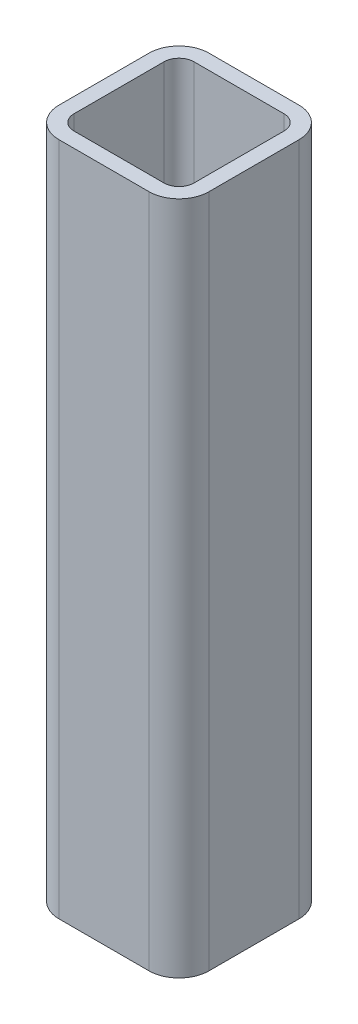
ISO-10303-21;
HEADER;
FILE_DESCRIPTION(('STEP AP214'),'2;1');
FILE_NAME('part.step','',(''),(''),'','','');
FILE_SCHEMA(('AUTOMOTIVE_DESIGN { 1 0 10303 214 1 1 1 1 }'));
ENDSEC;
DATA;
#1=APPLICATION_CONTEXT('core data for automotive mechanical design processes');
#2=APPLICATION_PROTOCOL_DEFINITION('international standard','automotive_design',2000,#1);
#3=PRODUCT_CONTEXT('',#1,'mechanical');
#4=PRODUCT('Part','Part','',(#3));
#5=PRODUCT_RELATED_PRODUCT_CATEGORY('part','',(#4));
#6=PRODUCT_DEFINITION_FORMATION('','',#4);
#7=PRODUCT_DEFINITION_CONTEXT('part definition',#1,'design');
#8=PRODUCT_DEFINITION('design','',#6,#7);
#9=PRODUCT_DEFINITION_SHAPE('','',#8);
#10=(LENGTH_UNIT() NAMED_UNIT(*) SI_UNIT(.MILLI.,.METRE.));
#11=(NAMED_UNIT(*) PLANE_ANGLE_UNIT() SI_UNIT($,.RADIAN.));
#12=(NAMED_UNIT(*) SI_UNIT($,.STERADIAN.) SOLID_ANGLE_UNIT());
#13=UNCERTAINTY_MEASURE_WITH_UNIT(LENGTH_MEASURE(1.E-05),#10,'distance_accuracy_value','');
#14=(GEOMETRIC_REPRESENTATION_CONTEXT(3) GLOBAL_UNCERTAINTY_ASSIGNED_CONTEXT((#13)) GLOBAL_UNIT_ASSIGNED_CONTEXT((#10,
#11,#12)) REPRESENTATION_CONTEXT('',''));
#15=CARTESIAN_POINT('',(0.,0.,0.));
#16=DIRECTION('',(0.,0.,1.));
#17=DIRECTION('',(1.,0.,0.));
#18=AXIS2_PLACEMENT_3D('',#15,#16,#17);
#19=CARTESIAN_POINT('',(6.00000000000001,90.0000000000001,-6.00000000000001));
#20=DIRECTION('',(0.,-1.,0.));
#21=DIRECTION('',(0.,0.,-1.));
#22=AXIS2_PLACEMENT_3D('',#19,#20,#21);
#23=CYLINDRICAL_SURFACE('',#22,4.);
#24=CARTESIAN_POINT('',(6.00000000000001,0.,-6.00000000000001));
#25=DIRECTION('',(0.,1.,0.));
#26=DIRECTION('',(0.,0.,1.));
#27=AXIS2_PLACEMENT_3D('',#24,#25,#26);
#28=CIRCLE('',#27,4.);
#29=CARTESIAN_POINT('',(10.,0.,-6.00000000000001));
#30=VERTEX_POINT('',#29);
#31=CARTESIAN_POINT('',(6.00000000000001,0.,-10.));
#32=VERTEX_POINT('',#31);
#33=EDGE_CURVE('E239',#30,#32,#28,.T.);
#34=ORIENTED_EDGE('',*,*,#33,.T.);
#35=DIRECTION('',(0.,-1.,0.));
#36=VECTOR('',#35,1.);
#37=CARTESIAN_POINT('',(6.00000000000001,90.0000000000001,-10.));
#38=LINE('',#37,#36);
#39=CARTESIAN_POINT('',(6.00000000000001,90.0000000000001,-10.));
#40=VERTEX_POINT('',#39);
#41=EDGE_CURVE('E12',#40,#32,#38,.T.);
#42=ORIENTED_EDGE('',*,*,#41,.F.);
#43=CARTESIAN_POINT('',(6.00000000000001,90.0000000000001,-6.00000000000001));
#44=DIRECTION('',(0.,1.,0.));
#45=DIRECTION('',(0.,0.,1.));
#46=AXIS2_PLACEMENT_3D('',#43,#44,#45);
#47=CIRCLE('',#46,4.);
#48=CARTESIAN_POINT('',(10.,90.0000000000001,-6.00000000000001));
#49=VERTEX_POINT('',#48);
#50=EDGE_CURVE('E317',#49,#40,#47,.T.);
#51=ORIENTED_EDGE('',*,*,#50,.F.);
#52=DIRECTION('',(0.,-1.,0.));
#53=VECTOR('',#52,1.);
#54=CARTESIAN_POINT('',(10.,90.0000000000001,-6.00000000000001));
#55=LINE('',#54,#53);
#56=EDGE_CURVE('E254',#49,#30,#55,.T.);
#57=ORIENTED_EDGE('',*,*,#56,.T.);
#58=EDGE_LOOP('',(#34,#42,#51,#57));
#59=FACE_BOUND('',#58,.T.);
#60=ADVANCED_FACE('F67',(#59),#23,.T.);
#61=CARTESIAN_POINT('',(6.00000000000001,90.0000000000001,-10.));
#62=DIRECTION('',(0.,0.,1.));
#63=DIRECTION('',(1.,0.,0.));
#64=AXIS2_PLACEMENT_3D('',#61,#62,#63);
#65=PLANE('',#64);
#66=DIRECTION('',(-1.,0.,0.));
#67=VECTOR('',#66,1.);
#68=CARTESIAN_POINT('',(6.00000000000001,0.,-10.));
#69=LINE('',#68,#67);
#70=CARTESIAN_POINT('',(-6.00000000000001,0.,-10.));
#71=VERTEX_POINT('',#70);
#72=EDGE_CURVE('E242',#32,#71,#69,.T.);
#73=ORIENTED_EDGE('',*,*,#72,.T.);
#74=DIRECTION('',(0.,-1.,0.));
#75=VECTOR('',#74,1.);
#76=CARTESIAN_POINT('',(-6.00000000000001,90.0000000000001,-10.));
#77=LINE('',#76,#75);
#78=CARTESIAN_POINT('',(-6.00000000000001,90.0000000000001,-10.));
#79=VERTEX_POINT('',#78);
#80=EDGE_CURVE('E77',#79,#71,#77,.T.);
#81=ORIENTED_EDGE('',*,*,#80,.F.);
#82=DIRECTION('',(-1.,0.,0.));
#83=VECTOR('',#82,1.);
#84=CARTESIAN_POINT('',(6.00000000000001,90.0000000000001,-10.));
#85=LINE('',#84,#83);
#86=EDGE_CURVE('E319',#40,#79,#85,.T.);
#87=ORIENTED_EDGE('',*,*,#86,.F.);
#88=ORIENTED_EDGE('',*,*,#41,.T.);
#89=EDGE_LOOP('',(#73,#81,#87,#88));
#90=FACE_BOUND('',#89,.T.);
#91=ADVANCED_FACE('F355',(#90),#65,.F.);
#92=CARTESIAN_POINT('',(-6.00000000000001,90.0000000000001,-6.00000000000001));
#93=DIRECTION('',(0.,-1.,0.));
#94=DIRECTION('',(0.,0.,-1.));
#95=AXIS2_PLACEMENT_3D('',#92,#93,#94);
#96=CYLINDRICAL_SURFACE('',#95,4.);
#97=CARTESIAN_POINT('',(-6.00000000000001,0.,-6.00000000000001));
#98=DIRECTION('',(0.,1.,0.));
#99=DIRECTION('',(0.,0.,1.));
#100=AXIS2_PLACEMENT_3D('',#97,#98,#99);
#101=CIRCLE('',#100,4.);
#102=CARTESIAN_POINT('',(-10.,0.,-6.00000000000001));
#103=VERTEX_POINT('',#102);
#104=EDGE_CURVE('E244',#71,#103,#101,.T.);
#105=ORIENTED_EDGE('',*,*,#104,.T.);
#106=DIRECTION('',(0.,-1.,0.));
#107=VECTOR('',#106,1.);
#108=CARTESIAN_POINT('',(-10.,90.0000000000001,-6.00000000000001));
#109=LINE('',#108,#107);
#110=CARTESIAN_POINT('',(-10.,90.0000000000001,-6.00000000000001));
#111=VERTEX_POINT('',#110);
#112=EDGE_CURVE('E261',#111,#103,#109,.T.);
#113=ORIENTED_EDGE('',*,*,#112,.F.);
#114=CARTESIAN_POINT('',(-6.00000000000001,90.0000000000001,-6.00000000000001));
#115=DIRECTION('',(0.,1.,0.));
#116=DIRECTION('',(0.,0.,1.));
#117=AXIS2_PLACEMENT_3D('',#114,#115,#116);
#118=CIRCLE('',#117,4.);
#119=EDGE_CURVE('E321',#79,#111,#118,.T.);
#120=ORIENTED_EDGE('',*,*,#119,.F.);
#121=ORIENTED_EDGE('',*,*,#80,.T.);
#122=EDGE_LOOP('',(#105,#113,#120,#121));
#123=FACE_BOUND('',#122,.T.);
#124=ADVANCED_FACE('F361',(#123),#96,.T.);
#125=CARTESIAN_POINT('',(-10.,90.0000000000001,6.00000000000001));
#126=DIRECTION('',(1.,0.,0.));
#127=DIRECTION('',(0.,0.,-1.));
#128=AXIS2_PLACEMENT_3D('',#125,#126,#127);
#129=PLANE('',#128);
#130=DIRECTION('',(0.,0.,1.));
#131=VECTOR('',#130,1.);
#132=CARTESIAN_POINT('',(-10.,0.,6.00000000000001));
#133=LINE('',#132,#131);
#134=CARTESIAN_POINT('',(-10.,0.,6.00000000000001));
#135=VERTEX_POINT('',#134);
#136=EDGE_CURVE('E246',#103,#135,#133,.T.);
#137=ORIENTED_EDGE('',*,*,#136,.T.);
#138=DIRECTION('',(0.,-1.,0.));
#139=VECTOR('',#138,1.);
#140=CARTESIAN_POINT('',(-10.,90.0000000000001,6.00000000000001));
#141=LINE('',#140,#139);
#142=CARTESIAN_POINT('',(-10.,90.0000000000001,6.00000000000001));
#143=VERTEX_POINT('',#142);
#144=EDGE_CURVE('E258',#143,#135,#141,.T.);
#145=ORIENTED_EDGE('',*,*,#144,.F.);
#146=DIRECTION('',(0.,0.,1.));
#147=VECTOR('',#146,1.);
#148=CARTESIAN_POINT('',(-10.,90.0000000000001,6.00000000000001));
#149=LINE('',#148,#147);
#150=EDGE_CURVE('E323',#111,#143,#149,.T.);
#151=ORIENTED_EDGE('',*,*,#150,.F.);
#152=ORIENTED_EDGE('',*,*,#112,.T.);
#153=EDGE_LOOP('',(#137,#145,#151,#152));
#154=FACE_BOUND('',#153,.T.);
#155=ADVANCED_FACE('F329',(#154),#129,.F.);
#156=CARTESIAN_POINT('',(-6.00000000000001,90.0000000000001,6.00000000000001));
#157=DIRECTION('',(0.,-1.,0.));
#158=DIRECTION('',(0.,0.,-1.));
#159=AXIS2_PLACEMENT_3D('',#156,#157,#158);
#160=CYLINDRICAL_SURFACE('',#159,4.);
#161=CARTESIAN_POINT('',(-6.00000000000001,0.,6.00000000000001));
#162=DIRECTION('',(0.,1.,0.));
#163=DIRECTION('',(0.,0.,1.));
#164=AXIS2_PLACEMENT_3D('',#161,#162,#163);
#165=CIRCLE('',#164,4.);
#166=CARTESIAN_POINT('',(-6.00000000000001,0.,10.));
#167=VERTEX_POINT('',#166);
#168=EDGE_CURVE('E248',#135,#167,#165,.T.);
#169=ORIENTED_EDGE('',*,*,#168,.T.);
#170=DIRECTION('',(0.,-1.,0.));
#171=VECTOR('',#170,1.);
#172=CARTESIAN_POINT('',(-6.00000000000001,90.0000000000001,10.));
#173=LINE('',#172,#171);
#174=CARTESIAN_POINT('',(-6.00000000000001,90.0000000000001,10.));
#175=VERTEX_POINT('',#174);
#176=EDGE_CURVE('E206',#175,#167,#173,.T.);
#177=ORIENTED_EDGE('',*,*,#176,.F.);
#178=CARTESIAN_POINT('',(-6.00000000000001,90.0000000000001,6.00000000000001));
#179=DIRECTION('',(0.,1.,0.));
#180=DIRECTION('',(0.,0.,1.));
#181=AXIS2_PLACEMENT_3D('',#178,#179,#180);
#182=CIRCLE('',#181,4.);
#183=EDGE_CURVE('E197',#143,#175,#182,.T.);
#184=ORIENTED_EDGE('',*,*,#183,.F.);
#185=ORIENTED_EDGE('',*,*,#144,.T.);
#186=EDGE_LOOP('',(#169,#177,#184,#185));
#187=FACE_BOUND('',#186,.T.);
#188=ADVANCED_FACE('F333',(#187),#160,.T.);
#189=CARTESIAN_POINT('',(-6.00000000000001,90.0000000000001,10.));
#190=DIRECTION('',(0.,0.,-1.));
#191=DIRECTION('',(-1.,0.,0.));
#192=AXIS2_PLACEMENT_3D('',#189,#190,#191);
#193=PLANE('',#192);
#194=DIRECTION('',(1.,0.,0.));
#195=VECTOR('',#194,1.);
#196=CARTESIAN_POINT('',(-6.00000000000001,0.,10.));
#197=LINE('',#196,#195);
#198=CARTESIAN_POINT('',(6.00000000000001,0.,10.));
#199=VERTEX_POINT('',#198);
#200=EDGE_CURVE('E205',#167,#199,#197,.T.);
#201=ORIENTED_EDGE('',*,*,#200,.T.);
#202=DIRECTION('',(0.,-1.,0.));
#203=VECTOR('',#202,1.);
#204=CARTESIAN_POINT('',(6.00000000000001,90.0000000000001,10.));
#205=LINE('',#204,#203);
#206=CARTESIAN_POINT('',(6.00000000000001,90.0000000000001,10.));
#207=VERTEX_POINT('',#206);
#208=EDGE_CURVE('E202',#207,#199,#205,.T.);
#209=ORIENTED_EDGE('',*,*,#208,.F.);
#210=DIRECTION('',(1.,0.,0.));
#211=VECTOR('',#210,1.);
#212=CARTESIAN_POINT('',(-6.00000000000001,90.0000000000001,10.));
#213=LINE('',#212,#211);
#214=EDGE_CURVE('E191',#175,#207,#213,.T.);
#215=ORIENTED_EDGE('',*,*,#214,.F.);
#216=ORIENTED_EDGE('',*,*,#176,.T.);
#217=EDGE_LOOP('',(#201,#209,#215,#216));
#218=FACE_BOUND('',#217,.T.);
#219=ADVANCED_FACE('F203',(#218),#193,.F.);
#220=CARTESIAN_POINT('',(6.00000000000001,90.0000000000001,6.00000000000001));
#221=DIRECTION('',(0.,-1.,0.));
#222=DIRECTION('',(0.,0.,-1.));
#223=AXIS2_PLACEMENT_3D('',#220,#221,#222);
#224=CYLINDRICAL_SURFACE('',#223,4.);
#225=CARTESIAN_POINT('',(6.00000000000001,0.,6.00000000000001));
#226=DIRECTION('',(0.,1.,0.));
#227=DIRECTION('',(0.,0.,1.));
#228=AXIS2_PLACEMENT_3D('',#225,#226,#227);
#229=CIRCLE('',#228,4.);
#230=CARTESIAN_POINT('',(10.,0.,6.00000000000001));
#231=VERTEX_POINT('',#230);
#232=EDGE_CURVE('E139',#199,#231,#229,.T.);
#233=ORIENTED_EDGE('',*,*,#232,.T.);
#234=DIRECTION('',(0.,-1.,0.));
#235=VECTOR('',#234,1.);
#236=CARTESIAN_POINT('',(10.,90.0000000000001,6.00000000000001));
#237=LINE('',#236,#235);
#238=CARTESIAN_POINT('',(10.,90.0000000000001,6.00000000000001));
#239=VERTEX_POINT('',#238);
#240=EDGE_CURVE('E207',#239,#231,#237,.T.);
#241=ORIENTED_EDGE('',*,*,#240,.F.);
#242=CARTESIAN_POINT('',(6.00000000000001,90.0000000000001,6.00000000000001));
#243=DIRECTION('',(0.,1.,0.));
#244=DIRECTION('',(0.,0.,1.));
#245=AXIS2_PLACEMENT_3D('',#242,#243,#244);
#246=CIRCLE('',#245,4.);
#247=EDGE_CURVE('E195',#207,#239,#246,.T.);
#248=ORIENTED_EDGE('',*,*,#247,.F.);
#249=ORIENTED_EDGE('',*,*,#208,.T.);
#250=EDGE_LOOP('',(#233,#241,#248,#249));
#251=FACE_BOUND('',#250,.T.);
#252=ADVANCED_FACE('F209',(#251),#224,.T.);
#253=CARTESIAN_POINT('',(-6.00000000000001,90.0000000000001,-6.00000000000001));
#254=DIRECTION('',(0.,-1.,0.));
#255=DIRECTION('',(0.,0.,-1.));
#256=AXIS2_PLACEMENT_3D('',#253,#254,#255);
#257=CYLINDRICAL_SURFACE('',#256,2.);
#258=CARTESIAN_POINT('',(-6.00000000000001,0.,-6.00000000000001));
#259=DIRECTION('',(0.,1.,0.));
#260=DIRECTION('',(0.,0.,1.));
#261=AXIS2_PLACEMENT_3D('',#258,#259,#260);
#262=CIRCLE('',#261,2.);
#263=CARTESIAN_POINT('',(-6.00000000000001,0.,-8.00000000000001));
#264=VERTEX_POINT('',#263);
#265=CARTESIAN_POINT('',(-8.00000000000001,0.,-6.00000000000001));
#266=VERTEX_POINT('',#265);
#267=EDGE_CURVE('E215',#264,#266,#262,.T.);
#268=ORIENTED_EDGE('',*,*,#267,.F.);
#269=DIRECTION('',(0.,-1.,0.));
#270=VECTOR('',#269,1.);
#271=CARTESIAN_POINT('',(-6.00000000000001,90.0000000000001,-8.00000000000001));
#272=LINE('',#271,#270);
#273=CARTESIAN_POINT('',(-6.00000000000001,90.0000000000001,-8.00000000000001));
#274=VERTEX_POINT('',#273);
#275=EDGE_CURVE('E71',#274,#264,#272,.T.);
#276=ORIENTED_EDGE('',*,*,#275,.F.);
#277=CARTESIAN_POINT('',(-6.00000000000001,90.0000000000001,-6.00000000000001));
#278=DIRECTION('',(0.,1.,0.));
#279=DIRECTION('',(0.,0.,1.));
#280=AXIS2_PLACEMENT_3D('',#277,#278,#279);
#281=CIRCLE('',#280,2.);
#282=CARTESIAN_POINT('',(-8.00000000000001,90.0000000000001,-6.00000000000001));
#283=VERTEX_POINT('',#282);
#284=EDGE_CURVE('E253',#274,#283,#281,.T.);
#285=ORIENTED_EDGE('',*,*,#284,.T.);
#286=DIRECTION('',(0.,-1.,0.));
#287=VECTOR('',#286,1.);
#288=CARTESIAN_POINT('',(-8.00000000000001,90.0000000000001,-6.00000000000001));
#289=LINE('',#288,#287);
#290=EDGE_CURVE('E211',#283,#266,#289,.T.);
#291=ORIENTED_EDGE('',*,*,#290,.T.);
#292=EDGE_LOOP('',(#268,#276,#285,#291));
#293=FACE_BOUND('',#292,.T.);
#294=ADVANCED_FACE('F69',(#293),#257,.F.);
#295=CARTESIAN_POINT('',(6.00000000000001,90.0000000000001,-8.00000000000001));
#296=DIRECTION('',(0.,0.,1.));
#297=DIRECTION('',(1.,0.,0.));
#298=AXIS2_PLACEMENT_3D('',#295,#296,#297);
#299=PLANE('',#298);
#300=DIRECTION('',(-1.,0.,0.));
#301=VECTOR('',#300,1.);
#302=CARTESIAN_POINT('',(6.00000000000001,0.,-8.00000000000001));
#303=LINE('',#302,#301);
#304=CARTESIAN_POINT('',(6.00000000000001,0.,-8.00000000000001));
#305=VERTEX_POINT('',#304);
#306=EDGE_CURVE('E218',#305,#264,#303,.T.);
#307=ORIENTED_EDGE('',*,*,#306,.F.);
#308=DIRECTION('',(0.,-1.,0.));
#309=VECTOR('',#308,1.);
#310=CARTESIAN_POINT('',(6.00000000000001,90.0000000000001,-8.00000000000001));
#311=LINE('',#310,#309);
#312=CARTESIAN_POINT('',(6.00000000000001,90.0000000000001,-8.00000000000001));
#313=VERTEX_POINT('',#312);
#314=EDGE_CURVE('E276',#313,#305,#311,.T.);
#315=ORIENTED_EDGE('',*,*,#314,.F.);
#316=DIRECTION('',(-1.,0.,0.));
#317=VECTOR('',#316,1.);
#318=CARTESIAN_POINT('',(6.00000000000001,90.0000000000001,-8.00000000000001));
#319=LINE('',#318,#317);
#320=EDGE_CURVE('E285',#313,#274,#319,.T.);
#321=ORIENTED_EDGE('',*,*,#320,.T.);
#322=ORIENTED_EDGE('',*,*,#275,.T.);
#323=EDGE_LOOP('',(#307,#315,#321,#322));
#324=FACE_BOUND('',#323,.T.);
#325=ADVANCED_FACE('F283',(#324),#299,.T.);
#326=CARTESIAN_POINT('',(6.00000000000001,90.0000000000001,-6.00000000000001));
#327=DIRECTION('',(0.,-1.,0.));
#328=DIRECTION('',(0.,0.,-1.));
#329=AXIS2_PLACEMENT_3D('',#326,#327,#328);
#330=CYLINDRICAL_SURFACE('',#329,2.);
#331=CARTESIAN_POINT('',(6.00000000000001,0.,-6.00000000000001));
#332=DIRECTION('',(0.,1.,0.));
#333=DIRECTION('',(0.,0.,1.));
#334=AXIS2_PLACEMENT_3D('',#331,#332,#333);
#335=CIRCLE('',#334,2.);
#336=CARTESIAN_POINT('',(8.00000000000001,0.,-6.00000000000001));
#337=VERTEX_POINT('',#336);
#338=EDGE_CURVE('E221',#337,#305,#335,.T.);
#339=ORIENTED_EDGE('',*,*,#338,.F.);
#340=DIRECTION('',(0.,-1.,0.));
#341=VECTOR('',#340,1.);
#342=CARTESIAN_POINT('',(8.00000000000001,90.0000000000001,-6.00000000000001));
#343=LINE('',#342,#341);
#344=CARTESIAN_POINT('',(8.00000000000001,90.0000000000001,-6.00000000000001));
#345=VERTEX_POINT('',#344);
#346=EDGE_CURVE('E275',#345,#337,#343,.T.);
#347=ORIENTED_EDGE('',*,*,#346,.F.);
#348=CARTESIAN_POINT('',(6.00000000000001,90.0000000000001,-6.00000000000001));
#349=DIRECTION('',(0.,1.,0.));
#350=DIRECTION('',(0.,0.,1.));
#351=AXIS2_PLACEMENT_3D('',#348,#349,#350);
#352=CIRCLE('',#351,2.);
#353=EDGE_CURVE('E293',#345,#313,#352,.T.);
#354=ORIENTED_EDGE('',*,*,#353,.T.);
#355=ORIENTED_EDGE('',*,*,#314,.T.);
#356=EDGE_LOOP('',(#339,#347,#354,#355));
#357=FACE_BOUND('',#356,.T.);
#358=ADVANCED_FACE('F291',(#357),#330,.F.);
#359=CARTESIAN_POINT('',(8.00000000000001,90.0000000000001,-6.00000000000001));
#360=DIRECTION('',(-1.,0.,0.));
#361=DIRECTION('',(0.,0.,1.));
#362=AXIS2_PLACEMENT_3D('',#359,#360,#361);
#363=PLANE('',#362);
#364=DIRECTION('',(0.,0.,-1.));
#365=VECTOR('',#364,1.);
#366=CARTESIAN_POINT('',(8.00000000000001,0.,-6.00000000000001));
#367=LINE('',#366,#365);
#368=CARTESIAN_POINT('',(8.00000000000001,0.,6.00000000000001));
#369=VERTEX_POINT('',#368);
#370=EDGE_CURVE('E224',#369,#337,#367,.T.);
#371=ORIENTED_EDGE('',*,*,#370,.F.);
#372=DIRECTION('',(0.,-1.,0.));
#373=VECTOR('',#372,1.);
#374=CARTESIAN_POINT('',(8.00000000000001,90.0000000000001,6.00000000000001));
#375=LINE('',#374,#373);
#376=CARTESIAN_POINT('',(8.00000000000001,90.0000000000001,6.00000000000001));
#377=VERTEX_POINT('',#376);
#378=EDGE_CURVE('E273',#377,#369,#375,.T.);
#379=ORIENTED_EDGE('',*,*,#378,.F.);
#380=DIRECTION('',(0.,0.,-1.));
#381=VECTOR('',#380,1.);
#382=CARTESIAN_POINT('',(8.00000000000001,90.0000000000001,-6.00000000000001));
#383=LINE('',#382,#381);
#384=EDGE_CURVE('E299',#377,#345,#383,.T.);
#385=ORIENTED_EDGE('',*,*,#384,.T.);
#386=ORIENTED_EDGE('',*,*,#346,.T.);
#387=EDGE_LOOP('',(#371,#379,#385,#386));
#388=FACE_BOUND('',#387,.T.);
#389=ADVANCED_FACE('F302',(#388),#363,.T.);
#390=CARTESIAN_POINT('',(6.00000000000001,90.0000000000001,6.00000000000001));
#391=DIRECTION('',(0.,-1.,0.));
#392=DIRECTION('',(0.,0.,-1.));
#393=AXIS2_PLACEMENT_3D('',#390,#391,#392);
#394=CYLINDRICAL_SURFACE('',#393,2.);
#395=CARTESIAN_POINT('',(6.00000000000001,0.,6.00000000000001));
#396=DIRECTION('',(0.,1.,0.));
#397=DIRECTION('',(0.,0.,1.));
#398=AXIS2_PLACEMENT_3D('',#395,#396,#397);
#399=CIRCLE('',#398,2.);
#400=CARTESIAN_POINT('',(6.00000000000001,0.,8.00000000000001));
#401=VERTEX_POINT('',#400);
#402=EDGE_CURVE('E227',#401,#369,#399,.T.);
#403=ORIENTED_EDGE('',*,*,#402,.F.);
#404=DIRECTION('',(0.,-1.,0.));
#405=VECTOR('',#404,1.);
#406=CARTESIAN_POINT('',(6.00000000000001,90.0000000000001,8.00000000000001));
#407=LINE('',#406,#405);
#408=CARTESIAN_POINT('',(6.00000000000001,90.0000000000001,8.00000000000001));
#409=VERTEX_POINT('',#408);
#410=EDGE_CURVE('E271',#409,#401,#407,.T.);
#411=ORIENTED_EDGE('',*,*,#410,.F.);
#412=CARTESIAN_POINT('',(6.00000000000001,90.0000000000001,6.00000000000001));
#413=DIRECTION('',(0.,1.,0.));
#414=DIRECTION('',(0.,0.,1.));
#415=AXIS2_PLACEMENT_3D('',#412,#413,#414);
#416=CIRCLE('',#415,2.);
#417=EDGE_CURVE('E303',#409,#377,#416,.T.);
#418=ORIENTED_EDGE('',*,*,#417,.T.);
#419=ORIENTED_EDGE('',*,*,#378,.T.);
#420=EDGE_LOOP('',(#403,#411,#418,#419));
#421=FACE_BOUND('',#420,.T.);
#422=ADVANCED_FACE('F372',(#421),#394,.F.);
#423=CARTESIAN_POINT('',(-6.00000000000001,90.0000000000001,8.00000000000001));
#424=DIRECTION('',(0.,0.,-1.));
#425=DIRECTION('',(-1.,0.,0.));
#426=AXIS2_PLACEMENT_3D('',#423,#424,#425);
#427=PLANE('',#426);
#428=DIRECTION('',(1.,0.,0.));
#429=VECTOR('',#428,1.);
#430=CARTESIAN_POINT('',(-6.00000000000001,0.,8.00000000000001));
#431=LINE('',#430,#429);
#432=CARTESIAN_POINT('',(-6.00000000000001,0.,8.00000000000001));
#433=VERTEX_POINT('',#432);
#434=EDGE_CURVE('E230',#433,#401,#431,.T.);
#435=ORIENTED_EDGE('',*,*,#434,.F.);
#436=DIRECTION('',(0.,-1.,0.));
#437=VECTOR('',#436,1.);
#438=CARTESIAN_POINT('',(-6.00000000000001,90.0000000000001,8.00000000000001));
#439=LINE('',#438,#437);
#440=CARTESIAN_POINT('',(-6.00000000000001,90.0000000000001,8.00000000000001));
#441=VERTEX_POINT('',#440);
#442=EDGE_CURVE('E269',#441,#433,#439,.T.);
#443=ORIENTED_EDGE('',*,*,#442,.F.);
#444=DIRECTION('',(1.,0.,0.));
#445=VECTOR('',#444,1.);
#446=CARTESIAN_POINT('',(-6.00000000000001,90.0000000000001,8.00000000000001));
#447=LINE('',#446,#445);
#448=EDGE_CURVE('E305',#441,#409,#447,.T.);
#449=ORIENTED_EDGE('',*,*,#448,.T.);
#450=ORIENTED_EDGE('',*,*,#410,.T.);
#451=EDGE_LOOP('',(#435,#443,#449,#450));
#452=FACE_BOUND('',#451,.T.);
#453=ADVANCED_FACE('F368',(#452),#427,.T.);
#454=CARTESIAN_POINT('',(-6.00000000000001,90.0000000000001,6.00000000000001));
#455=DIRECTION('',(0.,-1.,0.));
#456=DIRECTION('',(0.,0.,-1.));
#457=AXIS2_PLACEMENT_3D('',#454,#455,#456);
#458=CYLINDRICAL_SURFACE('',#457,2.);
#459=CARTESIAN_POINT('',(-6.00000000000001,0.,6.00000000000001));
#460=DIRECTION('',(0.,1.,0.));
#461=DIRECTION('',(0.,0.,1.));
#462=AXIS2_PLACEMENT_3D('',#459,#460,#461);
#463=CIRCLE('',#462,2.);
#464=CARTESIAN_POINT('',(-8.00000000000001,0.,6.00000000000001));
#465=VERTEX_POINT('',#464);
#466=EDGE_CURVE('E233',#465,#433,#463,.T.);
#467=ORIENTED_EDGE('',*,*,#466,.F.);
#468=DIRECTION('',(0.,-1.,0.));
#469=VECTOR('',#468,1.);
#470=CARTESIAN_POINT('',(-8.00000000000001,90.0000000000001,6.00000000000001));
#471=LINE('',#470,#469);
#472=CARTESIAN_POINT('',(-8.00000000000001,90.0000000000001,6.00000000000001));
#473=VERTEX_POINT('',#472);
#474=EDGE_CURVE('E267',#473,#465,#471,.T.);
#475=ORIENTED_EDGE('',*,*,#474,.F.);
#476=CARTESIAN_POINT('',(-6.00000000000001,90.0000000000001,6.00000000000001));
#477=DIRECTION('',(0.,1.,0.));
#478=DIRECTION('',(0.,0.,1.));
#479=AXIS2_PLACEMENT_3D('',#476,#477,#478);
#480=CIRCLE('',#479,2.);
#481=EDGE_CURVE('E311',#473,#441,#480,.T.);
#482=ORIENTED_EDGE('',*,*,#481,.T.);
#483=ORIENTED_EDGE('',*,*,#442,.T.);
#484=EDGE_LOOP('',(#467,#475,#482,#483));
#485=FACE_BOUND('',#484,.T.);
#486=ADVANCED_FACE('F349',(#485),#458,.F.);
#487=CARTESIAN_POINT('',(-8.00000000000001,90.0000000000001,6.00000000000001));
#488=DIRECTION('',(1.,0.,0.));
#489=DIRECTION('',(0.,0.,-1.));
#490=AXIS2_PLACEMENT_3D('',#487,#488,#489);
#491=PLANE('',#490);
#492=DIRECTION('',(0.,0.,1.));
#493=VECTOR('',#492,1.);
#494=CARTESIAN_POINT('',(-8.00000000000001,0.,6.00000000000001));
#495=LINE('',#494,#493);
#496=EDGE_CURVE('E236',#266,#465,#495,.T.);
#497=ORIENTED_EDGE('',*,*,#496,.F.);
#498=ORIENTED_EDGE('',*,*,#290,.F.);
#499=DIRECTION('',(0.,0.,1.));
#500=VECTOR('',#499,1.);
#501=CARTESIAN_POINT('',(-8.00000000000001,90.0000000000001,6.00000000000001));
#502=LINE('',#501,#500);
#503=EDGE_CURVE('E314',#283,#473,#502,.T.);
#504=ORIENTED_EDGE('',*,*,#503,.T.);
#505=ORIENTED_EDGE('',*,*,#474,.T.);
#506=EDGE_LOOP('',(#497,#498,#504,#505));
#507=FACE_BOUND('',#506,.T.);
#508=ADVANCED_FACE('F341',(#507),#491,.T.);
#509=CARTESIAN_POINT('',(10.,90.0000000000001,-6.00000000000001));
#510=DIRECTION('',(-1.,0.,0.));
#511=DIRECTION('',(0.,0.,1.));
#512=AXIS2_PLACEMENT_3D('',#509,#510,#511);
#513=PLANE('',#512);
#514=DIRECTION('',(0.,0.,-1.));
#515=VECTOR('',#514,1.);
#516=CARTESIAN_POINT('',(10.,0.,-6.00000000000001));
#517=LINE('',#516,#515);
#518=EDGE_CURVE('E145',#231,#30,#517,.T.);
#519=ORIENTED_EDGE('',*,*,#518,.T.);
#520=ORIENTED_EDGE('',*,*,#56,.F.);
#521=DIRECTION('',(0.,0.,-1.));
#522=VECTOR('',#521,1.);
#523=CARTESIAN_POINT('',(10.,90.0000000000001,-6.00000000000001));
#524=LINE('',#523,#522);
#525=EDGE_CURVE('E86',#239,#49,#524,.T.);
#526=ORIENTED_EDGE('',*,*,#525,.F.);
#527=ORIENTED_EDGE('',*,*,#240,.T.);
#528=EDGE_LOOP('',(#519,#520,#526,#527));
#529=FACE_BOUND('',#528,.T.);
#530=ADVANCED_FACE('F339',(#529),#513,.F.);
#531=CARTESIAN_POINT('',(6.00000000000001,90.0000000000001,-6.00000000000001));
#532=DIRECTION('',(0.,1.,0.));
#533=DIRECTION('',(0.,0.,1.));
#534=AXIS2_PLACEMENT_3D('',#531,#532,#533);
#535=PLANE('',#534);
#536=ORIENTED_EDGE('',*,*,#284,.F.);
#537=ORIENTED_EDGE('',*,*,#320,.F.);
#538=ORIENTED_EDGE('',*,*,#353,.F.);
#539=ORIENTED_EDGE('',*,*,#384,.F.);
#540=ORIENTED_EDGE('',*,*,#417,.F.);
#541=ORIENTED_EDGE('',*,*,#448,.F.);
#542=ORIENTED_EDGE('',*,*,#481,.F.);
#543=ORIENTED_EDGE('',*,*,#503,.F.);
#544=EDGE_LOOP('',(#536,#537,#538,#539,#540,#541,#542,#543));
#545=FACE_BOUND('',#544,.T.);
#546=ORIENTED_EDGE('',*,*,#50,.T.);
#547=ORIENTED_EDGE('',*,*,#86,.T.);
#548=ORIENTED_EDGE('',*,*,#119,.T.);
#549=ORIENTED_EDGE('',*,*,#150,.T.);
#550=ORIENTED_EDGE('',*,*,#183,.T.);
#551=ORIENTED_EDGE('',*,*,#214,.T.);
#552=ORIENTED_EDGE('',*,*,#247,.T.);
#553=ORIENTED_EDGE('',*,*,#525,.T.);
#554=EDGE_LOOP('',(#546,#547,#548,#549,#550,#551,#552,#553));
#555=FACE_BOUND('',#554,.T.);
#556=ADVANCED_FACE('F193',(#545,#555),#535,.T.);
#557=CARTESIAN_POINT('',(6.00000000000001,0.,-6.00000000000001));
#558=DIRECTION('',(0.,1.,0.));
#559=DIRECTION('',(0.,0.,1.));
#560=AXIS2_PLACEMENT_3D('',#557,#558,#559);
#561=PLANE('',#560);
#562=ORIENTED_EDGE('',*,*,#267,.T.);
#563=ORIENTED_EDGE('',*,*,#496,.T.);
#564=ORIENTED_EDGE('',*,*,#466,.T.);
#565=ORIENTED_EDGE('',*,*,#434,.T.);
#566=ORIENTED_EDGE('',*,*,#402,.T.);
#567=ORIENTED_EDGE('',*,*,#370,.T.);
#568=ORIENTED_EDGE('',*,*,#338,.T.);
#569=ORIENTED_EDGE('',*,*,#306,.T.);
#570=EDGE_LOOP('',(#562,#563,#564,#565,#566,#567,#568,#569));
#571=FACE_BOUND('',#570,.T.);
#572=ORIENTED_EDGE('',*,*,#33,.F.);
#573=ORIENTED_EDGE('',*,*,#518,.F.);
#574=ORIENTED_EDGE('',*,*,#232,.F.);
#575=ORIENTED_EDGE('',*,*,#200,.F.);
#576=ORIENTED_EDGE('',*,*,#168,.F.);
#577=ORIENTED_EDGE('',*,*,#136,.F.);
#578=ORIENTED_EDGE('',*,*,#104,.F.);
#579=ORIENTED_EDGE('',*,*,#72,.F.);
#580=EDGE_LOOP('',(#572,#573,#574,#575,#576,#577,#578,#579));
#581=FACE_BOUND('',#580,.T.);
#582=ADVANCED_FACE('F288',(#571,#581),#561,.F.);
#583=CLOSED_SHELL('',(#60,#91,#124,#155,#188,#219,#252,#294,#325,#358,#389,#422,#453,#486,#508,
#530,#556,#582));
#584=MANIFOLD_SOLID_BREP('B2',#583);
#585=ADVANCED_BREP_SHAPE_REPRESENTATION('',(#18,#584),#14);
#586=SHAPE_DEFINITION_REPRESENTATION(#9,#585);
ENDSEC;
END-ISO-10303-21;
